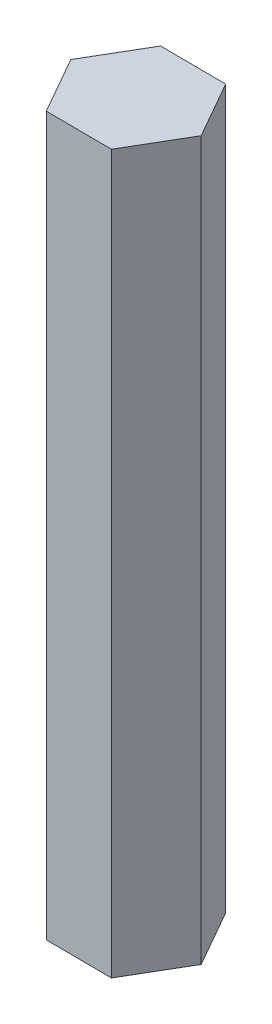
ISO-10303-21;
HEADER;
FILE_DESCRIPTION(('STEP AP214'),'2;1');
FILE_NAME('part.step','',(''),(''),'','','');
FILE_SCHEMA(('AUTOMOTIVE_DESIGN { 1 0 10303 214 1 1 1 1 }'));
ENDSEC;
DATA;
#1=APPLICATION_CONTEXT('core data for automotive mechanical design processes');
#2=APPLICATION_PROTOCOL_DEFINITION('international standard','automotive_design',2000,#1);
#3=PRODUCT_CONTEXT('',#1,'mechanical');
#4=PRODUCT('Part','Part','',(#3));
#5=PRODUCT_RELATED_PRODUCT_CATEGORY('part','',(#4));
#6=PRODUCT_DEFINITION_FORMATION('','',#4);
#7=PRODUCT_DEFINITION_CONTEXT('part definition',#1,'design');
#8=PRODUCT_DEFINITION('design','',#6,#7);
#9=PRODUCT_DEFINITION_SHAPE('','',#8);
#10=(LENGTH_UNIT() NAMED_UNIT(*) SI_UNIT(.MILLI.,.METRE.));
#11=(NAMED_UNIT(*) PLANE_ANGLE_UNIT() SI_UNIT($,.RADIAN.));
#12=(NAMED_UNIT(*) SI_UNIT($,.STERADIAN.) SOLID_ANGLE_UNIT());
#13=UNCERTAINTY_MEASURE_WITH_UNIT(LENGTH_MEASURE(1.E-05),#10,'distance_accuracy_value','');
#14=(GEOMETRIC_REPRESENTATION_CONTEXT(3) GLOBAL_UNCERTAINTY_ASSIGNED_CONTEXT((#13)) GLOBAL_UNIT_ASSIGNED_CONTEXT((#10,
#11,#12)) REPRESENTATION_CONTEXT('',''));
#15=CARTESIAN_POINT('',(0.,0.,0.));
#16=DIRECTION('',(0.,0.,1.));
#17=DIRECTION('',(1.,0.,0.));
#18=AXIS2_PLACEMENT_3D('',#15,#16,#17);
#19=CARTESIAN_POINT('',(9.49981790938041,104.,0.0588191177702508));
#20=DIRECTION('',(-0.869104547340519,0.,0.494628432049787));
#21=DIRECTION('',(0.494628432049787,0.,0.869104547340519));
#22=AXIS2_PLACEMENT_3D('',#19,#20,#21);
#23=PLANE('',#22);
#24=DIRECTION('',(-0.494628432049787,0.,-0.869104547340519));
#25=VECTOR('',#24,1.);
#26=CARTESIAN_POINT('',(9.49981790938041,0.,0.0588191177702508));
#27=LINE('',#26,#25);
#28=CARTESIAN_POINT('',(9.49981790938041,0.,0.0588191177702508));
#29=VERTEX_POINT('',#28);
#30=CARTESIAN_POINT('',(4.80084780490743,0.,-8.19767408196469));
#31=VERTEX_POINT('',#30);
#32=EDGE_CURVE('E117',#29,#31,#27,.T.);
#33=ORIENTED_EDGE('',*,*,#32,.T.);
#34=DIRECTION('',(0.,-1.,0.));
#35=VECTOR('',#34,1.);
#36=CARTESIAN_POINT('',(4.80084780490743,104.,-8.19767408196469));
#37=LINE('',#36,#35);
#38=CARTESIAN_POINT('',(4.80084780490743,104.,-8.19767408196469));
#39=VERTEX_POINT('',#38);
#40=EDGE_CURVE('E11',#39,#31,#37,.T.);
#41=ORIENTED_EDGE('',*,*,#40,.F.);
#42=DIRECTION('',(-0.494628432049787,0.,-0.869104547340519));
#43=VECTOR('',#42,1.);
#44=CARTESIAN_POINT('',(9.49981790938041,104.,0.0588191177702508));
#45=LINE('',#44,#43);
#46=CARTESIAN_POINT('',(9.49981790938041,104.,0.0588191177702508));
#47=VERTEX_POINT('',#46);
#48=EDGE_CURVE('E127',#47,#39,#45,.T.);
#49=ORIENTED_EDGE('',*,*,#48,.F.);
#50=DIRECTION('',(0.,-1.,0.));
#51=VECTOR('',#50,1.);
#52=CARTESIAN_POINT('',(9.49981790938041,104.,0.0588191177702508));
#53=LINE('',#52,#51);
#54=EDGE_CURVE('E113',#47,#29,#53,.T.);
#55=ORIENTED_EDGE('',*,*,#54,.T.);
#56=EDGE_LOOP('',(#33,#41,#49,#55));
#57=FACE_BOUND('',#56,.T.);
#58=ADVANCED_FACE('F33',(#57),#23,.F.);
#59=CARTESIAN_POINT('',(4.80084780490743,104.,-8.19767408196469));
#60=DIRECTION('',(-0.00619148608107877,0.,0.999980832566359));
#61=DIRECTION('',(0.999980832566359,0.,0.00619148608107877));
#62=AXIS2_PLACEMENT_3D('',#59,#60,#61);
#63=PLANE('',#62);
#64=DIRECTION('',(-0.999980832566359,0.,-0.00619148608107877));
#65=VECTOR('',#64,1.);
#66=CARTESIAN_POINT('',(4.80084780490743,0.,-8.19767408196469));
#67=LINE('',#66,#65);
#68=CARTESIAN_POINT('',(-4.69897010447298,0.,-8.25649319973494));
#69=VERTEX_POINT('',#68);
#70=EDGE_CURVE('E120',#31,#69,#67,.T.);
#71=ORIENTED_EDGE('',*,*,#70,.T.);
#72=DIRECTION('',(0.,-1.,0.));
#73=VECTOR('',#72,1.);
#74=CARTESIAN_POINT('',(-4.69897010447298,104.,-8.25649319973494));
#75=LINE('',#74,#73);
#76=CARTESIAN_POINT('',(-4.69897010447298,104.,-8.25649319973494));
#77=VERTEX_POINT('',#76);
#78=EDGE_CURVE('E41',#77,#69,#75,.T.);
#79=ORIENTED_EDGE('',*,*,#78,.F.);
#80=DIRECTION('',(-0.999980832566359,0.,-0.00619148608107877));
#81=VECTOR('',#80,1.);
#82=CARTESIAN_POINT('',(4.80084780490743,104.,-8.19767408196469));
#83=LINE('',#82,#81);
#84=EDGE_CURVE('E86',#39,#77,#83,.T.);
#85=ORIENTED_EDGE('',*,*,#84,.F.);
#86=ORIENTED_EDGE('',*,*,#40,.T.);
#87=EDGE_LOOP('',(#71,#79,#85,#86));
#88=FACE_BOUND('',#87,.T.);
#89=ADVANCED_FACE('F151',(#88),#63,.F.);
#90=CARTESIAN_POINT('',(-4.69897010447298,104.,-8.25649319973494));
#91=DIRECTION('',(0.862913061259441,0.,0.505352400516571));
#92=DIRECTION('',(0.505352400516571,0.,-0.862913061259441));
#93=AXIS2_PLACEMENT_3D('',#90,#91,#92);
#94=PLANE('',#93);
#95=DIRECTION('',(-0.505352400516571,0.,0.862913061259441));
#96=VECTOR('',#95,1.);
#97=CARTESIAN_POINT('',(-4.69897010447298,0.,-8.25649319973494));
#98=LINE('',#97,#96);
#99=CARTESIAN_POINT('',(-9.49981790938041,0.,-0.0588191177702461));
#100=VERTEX_POINT('',#99);
#101=EDGE_CURVE('E122',#69,#100,#98,.T.);
#102=ORIENTED_EDGE('',*,*,#101,.T.);
#103=DIRECTION('',(0.,-1.,0.));
#104=VECTOR('',#103,1.);
#105=CARTESIAN_POINT('',(-9.49981790938041,104.,-0.0588191177702461));
#106=LINE('',#105,#104);
#107=CARTESIAN_POINT('',(-9.49981790938041,104.,-0.0588191177702461));
#108=VERTEX_POINT('',#107);
#109=EDGE_CURVE('E108',#108,#100,#106,.T.);
#110=ORIENTED_EDGE('',*,*,#109,.F.);
#111=DIRECTION('',(-0.505352400516571,0.,0.862913061259441));
#112=VECTOR('',#111,1.);
#113=CARTESIAN_POINT('',(-4.69897010447298,104.,-8.25649319973494));
#114=LINE('',#113,#112);
#115=EDGE_CURVE('E99',#77,#108,#114,.T.);
#116=ORIENTED_EDGE('',*,*,#115,.F.);
#117=ORIENTED_EDGE('',*,*,#78,.T.);
#118=EDGE_LOOP('',(#102,#110,#116,#117));
#119=FACE_BOUND('',#118,.T.);
#120=ADVANCED_FACE('F133',(#119),#94,.F.);
#121=CARTESIAN_POINT('',(-9.49981790938041,104.,-0.0588191177702461));
#122=DIRECTION('',(0.869104547340519,0.,-0.494628432049788));
#123=DIRECTION('',(-0.494628432049788,0.,-0.869104547340519));
#124=AXIS2_PLACEMENT_3D('',#121,#122,#123);
#125=PLANE('',#124);
#126=DIRECTION('',(0.494628432049787,0.,0.869104547340519));
#127=VECTOR('',#126,1.);
#128=CARTESIAN_POINT('',(-9.49981790938041,0.,-0.0588191177702461));
#129=LINE('',#128,#127);
#130=CARTESIAN_POINT('',(-4.80084780490742,0.,8.19767408196469));
#131=VERTEX_POINT('',#130);
#132=EDGE_CURVE('E107',#100,#131,#129,.T.);
#133=ORIENTED_EDGE('',*,*,#132,.T.);
#134=DIRECTION('',(0.,-1.,0.));
#135=VECTOR('',#134,1.);
#136=CARTESIAN_POINT('',(-4.80084780490742,104.,8.19767408196469));
#137=LINE('',#136,#135);
#138=CARTESIAN_POINT('',(-4.80084780490742,104.,8.19767408196469));
#139=VERTEX_POINT('',#138);
#140=EDGE_CURVE('E104',#139,#131,#137,.T.);
#141=ORIENTED_EDGE('',*,*,#140,.F.);
#142=DIRECTION('',(0.494628432049787,0.,0.869104547340519));
#143=VECTOR('',#142,1.);
#144=CARTESIAN_POINT('',(-9.49981790938041,104.,-0.0588191177702461));
#145=LINE('',#144,#143);
#146=EDGE_CURVE('E93',#108,#139,#145,.T.);
#147=ORIENTED_EDGE('',*,*,#146,.F.);
#148=ORIENTED_EDGE('',*,*,#109,.T.);
#149=EDGE_LOOP('',(#133,#141,#147,#148));
#150=FACE_BOUND('',#149,.T.);
#151=ADVANCED_FACE('F105',(#150),#125,.F.);
#152=CARTESIAN_POINT('',(-4.80084780490742,104.,8.19767408196469));
#153=DIRECTION('',(0.00619148608107895,0.,-0.999980832566359));
#154=DIRECTION('',(-0.999980832566359,0.,-0.00619148608107895));
#155=AXIS2_PLACEMENT_3D('',#152,#153,#154);
#156=PLANE('',#155);
#157=DIRECTION('',(0.999980832566359,0.,0.00619148608107895));
#158=VECTOR('',#157,1.);
#159=CARTESIAN_POINT('',(-4.80084780490742,0.,8.19767408196469));
#160=LINE('',#159,#158);
#161=CARTESIAN_POINT('',(4.69897010447298,0.,8.25649319973494));
#162=VERTEX_POINT('',#161);
#163=EDGE_CURVE('E72',#131,#162,#160,.T.);
#164=ORIENTED_EDGE('',*,*,#163,.T.);
#165=DIRECTION('',(0.,-1.,0.));
#166=VECTOR('',#165,1.);
#167=CARTESIAN_POINT('',(4.69897010447298,104.,8.25649319973494));
#168=LINE('',#167,#166);
#169=CARTESIAN_POINT('',(4.69897010447298,104.,8.25649319973494));
#170=VERTEX_POINT('',#169);
#171=EDGE_CURVE('E109',#170,#162,#168,.T.);
#172=ORIENTED_EDGE('',*,*,#171,.F.);
#173=DIRECTION('',(0.999980832566359,0.,0.00619148608107895));
#174=VECTOR('',#173,1.);
#175=CARTESIAN_POINT('',(-4.80084780490742,104.,8.19767408196469));
#176=LINE('',#175,#174);
#177=EDGE_CURVE('E97',#139,#170,#176,.T.);
#178=ORIENTED_EDGE('',*,*,#177,.F.);
#179=ORIENTED_EDGE('',*,*,#140,.T.);
#180=EDGE_LOOP('',(#164,#172,#178,#179));
#181=FACE_BOUND('',#180,.T.);
#182=ADVANCED_FACE('F111',(#181),#156,.F.);
#183=CARTESIAN_POINT('',(4.69897010447298,104.,8.25649319973494));
#184=DIRECTION('',(-0.86291306125944,0.,-0.505352400516571));
#185=DIRECTION('',(-0.505352400516571,0.,0.862913061259441));
#186=AXIS2_PLACEMENT_3D('',#183,#184,#185);
#187=PLANE('',#186);
#188=DIRECTION('',(0.505352400516571,0.,-0.862913061259441));
#189=VECTOR('',#188,1.);
#190=CARTESIAN_POINT('',(4.69897010447298,0.,8.25649319973494));
#191=LINE('',#190,#189);
#192=EDGE_CURVE('E78',#162,#29,#191,.T.);
#193=ORIENTED_EDGE('',*,*,#192,.T.);
#194=ORIENTED_EDGE('',*,*,#54,.F.);
#195=DIRECTION('',(0.505352400516571,0.,-0.862913061259441));
#196=VECTOR('',#195,1.);
#197=CARTESIAN_POINT('',(4.69897010447298,104.,8.25649319973494));
#198=LINE('',#197,#196);
#199=EDGE_CURVE('E49',#170,#47,#198,.T.);
#200=ORIENTED_EDGE('',*,*,#199,.F.);
#201=ORIENTED_EDGE('',*,*,#171,.T.);
#202=EDGE_LOOP('',(#193,#194,#200,#201));
#203=FACE_BOUND('',#202,.T.);
#204=ADVANCED_FACE('F140',(#203),#187,.F.);
#205=CARTESIAN_POINT('',(0.,104.,0.));
#206=DIRECTION('',(0.,1.,0.));
#207=DIRECTION('',(0.,0.,1.));
#208=AXIS2_PLACEMENT_3D('',#205,#206,#207);
#209=PLANE('',#208);
#210=ORIENTED_EDGE('',*,*,#48,.T.);
#211=ORIENTED_EDGE('',*,*,#84,.T.);
#212=ORIENTED_EDGE('',*,*,#115,.T.);
#213=ORIENTED_EDGE('',*,*,#146,.T.);
#214=ORIENTED_EDGE('',*,*,#177,.T.);
#215=ORIENTED_EDGE('',*,*,#199,.T.);
#216=EDGE_LOOP('',(#210,#211,#212,#213,#214,#215));
#217=FACE_BOUND('',#216,.T.);
#218=ADVANCED_FACE('F95',(#217),#209,.T.);
#219=CARTESIAN_POINT('',(0.,0.,0.));
#220=DIRECTION('',(0.,1.,0.));
#221=DIRECTION('',(0.,0.,1.));
#222=AXIS2_PLACEMENT_3D('',#219,#220,#221);
#223=PLANE('',#222);
#224=ORIENTED_EDGE('',*,*,#32,.F.);
#225=ORIENTED_EDGE('',*,*,#192,.F.);
#226=ORIENTED_EDGE('',*,*,#163,.F.);
#227=ORIENTED_EDGE('',*,*,#132,.F.);
#228=ORIENTED_EDGE('',*,*,#101,.F.);
#229=ORIENTED_EDGE('',*,*,#70,.F.);
#230=EDGE_LOOP('',(#224,#225,#226,#227,#228,#229));
#231=FACE_BOUND('',#230,.T.);
#232=ADVANCED_FACE('F136',(#231),#223,.F.);
#233=CLOSED_SHELL('',(#58,#89,#120,#151,#182,#204,#218,#232));
#234=MANIFOLD_SOLID_BREP('B2',#233);
#235=ADVANCED_BREP_SHAPE_REPRESENTATION('',(#18,#234),#14);
#236=SHAPE_DEFINITION_REPRESENTATION(#9,#235);
ENDSEC;
END-ISO-10303-21;
